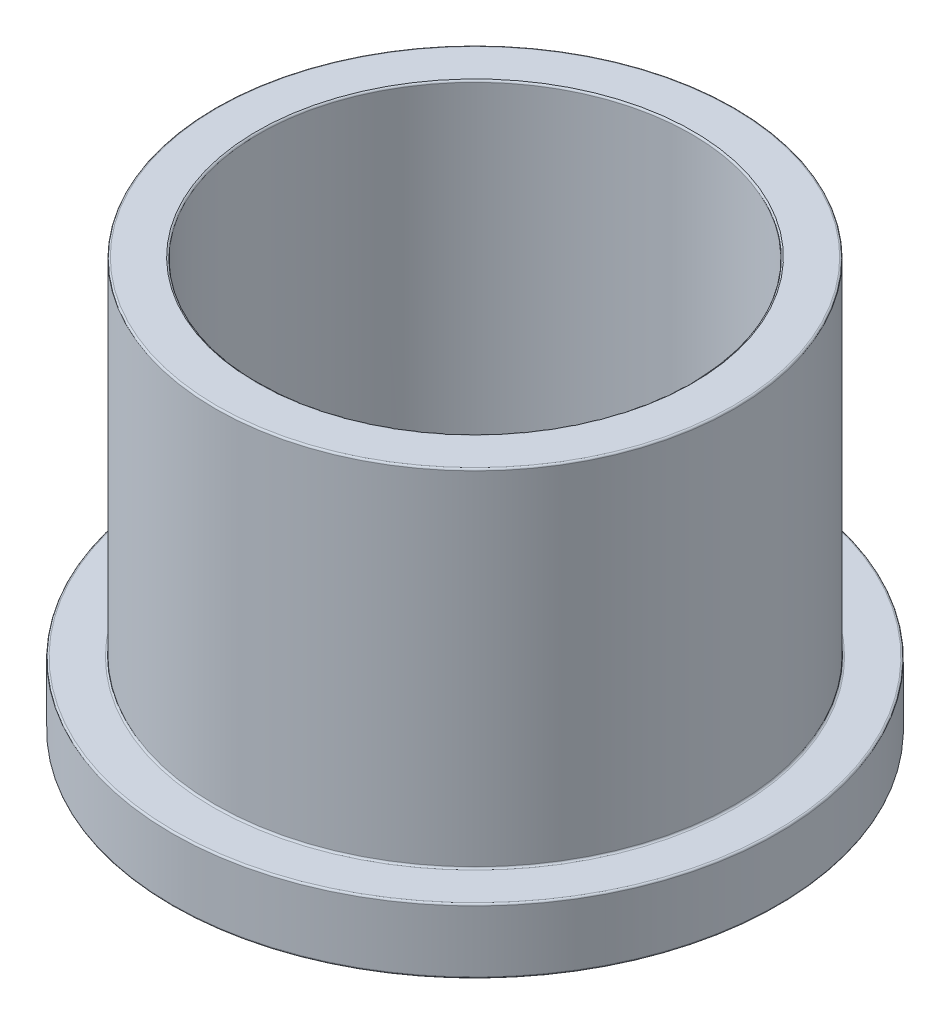
ISO-10303-21;
HEADER;
FILE_DESCRIPTION(('STEP AP214'),'2;1');
FILE_NAME('part.step','',(''),(''),'','','');
FILE_SCHEMA(('AUTOMOTIVE_DESIGN { 1 0 10303 214 1 1 1 1 }'));
ENDSEC;
DATA;
#1=APPLICATION_CONTEXT('core data for automotive mechanical design processes');
#2=APPLICATION_PROTOCOL_DEFINITION('international standard','automotive_design',2000,#1);
#3=PRODUCT_CONTEXT('',#1,'mechanical');
#4=PRODUCT('Part','Part','',(#3));
#5=PRODUCT_RELATED_PRODUCT_CATEGORY('part','',(#4));
#6=PRODUCT_DEFINITION_FORMATION('','',#4);
#7=PRODUCT_DEFINITION_CONTEXT('part definition',#1,'design');
#8=PRODUCT_DEFINITION('design','',#6,#7);
#9=PRODUCT_DEFINITION_SHAPE('','',#8);
#10=(LENGTH_UNIT() NAMED_UNIT(*) SI_UNIT(.MILLI.,.METRE.));
#11=(NAMED_UNIT(*) PLANE_ANGLE_UNIT() SI_UNIT($,.RADIAN.));
#12=(NAMED_UNIT(*) SI_UNIT($,.STERADIAN.) SOLID_ANGLE_UNIT());
#13=UNCERTAINTY_MEASURE_WITH_UNIT(LENGTH_MEASURE(1.E-05),#10,'distance_accuracy_value','');
#14=(GEOMETRIC_REPRESENTATION_CONTEXT(3) GLOBAL_UNCERTAINTY_ASSIGNED_CONTEXT((#13)) GLOBAL_UNIT_ASSIGNED_CONTEXT((#10,
#11,#12)) REPRESENTATION_CONTEXT('',''));
#15=CARTESIAN_POINT('',(0.,0.,0.));
#16=DIRECTION('',(0.,0.,1.));
#17=DIRECTION('',(1.,0.,0.));
#18=AXIS2_PLACEMENT_3D('',#15,#16,#17);
#19=CARTESIAN_POINT('',(22.225,0.,0.));
#20=DIRECTION('',(0.,-1.,0.));
#21=DIRECTION('',(0.,0.,-1.));
#22=AXIS2_PLACEMENT_3D('',#19,#20,#21);
#23=PLANE('',#22);
#24=CARTESIAN_POINT('',(0.,0.,0.));
#25=DIRECTION('',(0.,-1.,0.));
#26=DIRECTION('',(0.,0.,-1.));
#27=AXIS2_PLACEMENT_3D('',#24,#25,#26);
#28=CIRCLE('',#27,22.098);
#29=CARTESIAN_POINT('',(0.,0.,-22.098));
#30=VERTEX_POINT('',#29);
#31=EDGE_CURVE('E68',#30,#30,#28,.T.);
#32=ORIENTED_EDGE('',*,*,#31,.T.);
#33=EDGE_LOOP('',(#32));
#34=FACE_BOUND('',#33,.T.);
#35=CARTESIAN_POINT('',(0.,0.,0.));
#36=DIRECTION('',(0.,-1.,0.));
#37=DIRECTION('',(0.,0.,-1.));
#38=AXIS2_PLACEMENT_3D('',#35,#36,#37);
#39=CIRCLE('',#38,16.002);
#40=CARTESIAN_POINT('',(0.,0.,-16.002));
#41=VERTEX_POINT('',#40);
#42=EDGE_CURVE('E71',#41,#41,#39,.F.);
#43=ORIENTED_EDGE('',*,*,#42,.T.);
#44=EDGE_LOOP('',(#43));
#45=FACE_BOUND('',#44,.T.);
#46=ADVANCED_FACE('F30',(#34,#45),#23,.T.);
#47=CARTESIAN_POINT('',(0.,0.,0.));
#48=DIRECTION('',(0.,-1.,0.));
#49=DIRECTION('',(0.,0.,-1.));
#50=AXIS2_PLACEMENT_3D('',#47,#48,#49);
#51=CYLINDRICAL_SURFACE('',#50,15.875);
#52=CARTESIAN_POINT('',(0.,30.0355,0.));
#53=DIRECTION('',(0.,1.,0.));
#54=DIRECTION('',(0.,0.,1.));
#55=AXIS2_PLACEMENT_3D('',#52,#53,#54);
#56=CIRCLE('',#55,15.875);
#57=CARTESIAN_POINT('',(0.,30.0355,15.875));
#58=VERTEX_POINT('',#57);
#59=EDGE_CURVE('E10',#58,#58,#56,.T.);
#60=ORIENTED_EDGE('',*,*,#59,.T.);
#61=EDGE_LOOP('',(#60));
#62=FACE_BOUND('',#61,.T.);
#63=CARTESIAN_POINT('',(0.,0.127000000000001,0.));
#64=DIRECTION('',(0.,-1.,0.));
#65=DIRECTION('',(0.,0.,-1.));
#66=AXIS2_PLACEMENT_3D('',#63,#64,#65);
#67=CIRCLE('',#66,15.875);
#68=CARTESIAN_POINT('',(0.,0.127000000000001,-15.875));
#69=VERTEX_POINT('',#68);
#70=EDGE_CURVE('E37',#69,#69,#67,.T.);
#71=ORIENTED_EDGE('',*,*,#70,.T.);
#72=EDGE_LOOP('',(#71));
#73=FACE_BOUND('',#72,.T.);
#74=ADVANCED_FACE('F85',(#62,#73),#51,.F.);
#75=CARTESIAN_POINT('',(15.875,30.1625,0.));
#76=DIRECTION('',(0.,1.,0.));
#77=DIRECTION('',(0.,0.,1.));
#78=AXIS2_PLACEMENT_3D('',#75,#76,#77);
#79=PLANE('',#78);
#80=CARTESIAN_POINT('',(0.,30.1625,0.));
#81=DIRECTION('',(0.,1.,0.));
#82=DIRECTION('',(0.,0.,1.));
#83=AXIS2_PLACEMENT_3D('',#80,#81,#82);
#84=CIRCLE('',#83,18.923);
#85=CARTESIAN_POINT('',(0.,30.1625,18.923));
#86=VERTEX_POINT('',#85);
#87=EDGE_CURVE('E41',#86,#86,#84,.T.);
#88=ORIENTED_EDGE('',*,*,#87,.T.);
#89=EDGE_LOOP('',(#88));
#90=FACE_BOUND('',#89,.T.);
#91=CARTESIAN_POINT('',(0.,30.1625,0.));
#92=DIRECTION('',(0.,1.,0.));
#93=DIRECTION('',(0.,0.,1.));
#94=AXIS2_PLACEMENT_3D('',#91,#92,#93);
#95=CIRCLE('',#94,16.002);
#96=CARTESIAN_POINT('',(0.,30.1625,16.002));
#97=VERTEX_POINT('',#96);
#98=EDGE_CURVE('E45',#97,#97,#95,.F.);
#99=ORIENTED_EDGE('',*,*,#98,.T.);
#100=EDGE_LOOP('',(#99));
#101=FACE_BOUND('',#100,.T.);
#102=ADVANCED_FACE('F91',(#90,#101),#79,.T.);
#103=CARTESIAN_POINT('',(0.,0.,0.));
#104=DIRECTION('',(0.,-1.,0.));
#105=DIRECTION('',(0.,0.,-1.));
#106=AXIS2_PLACEMENT_3D('',#103,#104,#105);
#107=CYLINDRICAL_SURFACE('',#106,19.05);
#108=CARTESIAN_POINT('',(0.,4.8895,0.));
#109=DIRECTION('',(0.,1.,0.));
#110=DIRECTION('',(0.,0.,1.));
#111=AXIS2_PLACEMENT_3D('',#108,#109,#110);
#112=CIRCLE('',#111,19.05);
#113=CARTESIAN_POINT('',(0.,4.8895,19.05));
#114=VERTEX_POINT('',#113);
#115=EDGE_CURVE('E50',#114,#114,#112,.T.);
#116=ORIENTED_EDGE('',*,*,#115,.T.);
#117=EDGE_LOOP('',(#116));
#118=FACE_BOUND('',#117,.T.);
#119=CARTESIAN_POINT('',(0.,30.0355,0.));
#120=DIRECTION('',(0.,1.,0.));
#121=DIRECTION('',(0.,0.,1.));
#122=AXIS2_PLACEMENT_3D('',#119,#120,#121);
#123=CIRCLE('',#122,19.05);
#124=CARTESIAN_POINT('',(0.,30.0355,19.05));
#125=VERTEX_POINT('',#124);
#126=EDGE_CURVE('E53',#125,#125,#123,.F.);
#127=ORIENTED_EDGE('',*,*,#126,.T.);
#128=EDGE_LOOP('',(#127));
#129=FACE_BOUND('',#128,.T.);
#130=ADVANCED_FACE('F116',(#118,#129),#107,.T.);
#131=CARTESIAN_POINT('',(19.05,4.7625,0.));
#132=DIRECTION('',(0.,1.,0.));
#133=DIRECTION('',(0.,0.,1.));
#134=AXIS2_PLACEMENT_3D('',#131,#132,#133);
#135=PLANE('',#134);
#136=CARTESIAN_POINT('',(0.,4.7625,0.));
#137=DIRECTION('',(0.,1.,0.));
#138=DIRECTION('',(0.,0.,1.));
#139=AXIS2_PLACEMENT_3D('',#136,#137,#138);
#140=CIRCLE('',#139,22.098);
#141=CARTESIAN_POINT('',(0.,4.7625,22.098));
#142=VERTEX_POINT('',#141);
#143=EDGE_CURVE('E56',#142,#142,#140,.T.);
#144=ORIENTED_EDGE('',*,*,#143,.T.);
#145=EDGE_LOOP('',(#144));
#146=FACE_BOUND('',#145,.T.);
#147=CARTESIAN_POINT('',(0.,4.7625,0.));
#148=DIRECTION('',(0.,1.,0.));
#149=DIRECTION('',(0.,0.,1.));
#150=AXIS2_PLACEMENT_3D('',#147,#148,#149);
#151=CIRCLE('',#150,19.177);
#152=CARTESIAN_POINT('',(0.,4.7625,19.177));
#153=VERTEX_POINT('',#152);
#154=EDGE_CURVE('E59',#153,#153,#151,.F.);
#155=ORIENTED_EDGE('',*,*,#154,.T.);
#156=EDGE_LOOP('',(#155));
#157=FACE_BOUND('',#156,.T.);
#158=ADVANCED_FACE('F118',(#146,#157),#135,.T.);
#159=CARTESIAN_POINT('',(0.,0.,0.));
#160=DIRECTION('',(0.,-1.,0.));
#161=DIRECTION('',(0.,0.,-1.));
#162=AXIS2_PLACEMENT_3D('',#159,#160,#161);
#163=CYLINDRICAL_SURFACE('',#162,22.225);
#164=CARTESIAN_POINT('',(0.,0.127000000000001,0.));
#165=DIRECTION('',(0.,-1.,0.));
#166=DIRECTION('',(0.,0.,-1.));
#167=AXIS2_PLACEMENT_3D('',#164,#165,#166);
#168=CIRCLE('',#167,22.225);
#169=CARTESIAN_POINT('',(0.,0.127000000000001,-22.225));
#170=VERTEX_POINT('',#169);
#171=EDGE_CURVE('E62',#170,#170,#168,.F.);
#172=ORIENTED_EDGE('',*,*,#171,.T.);
#173=EDGE_LOOP('',(#172));
#174=FACE_BOUND('',#173,.T.);
#175=CARTESIAN_POINT('',(0.,4.6355,0.));
#176=DIRECTION('',(0.,1.,0.));
#177=DIRECTION('',(0.,0.,1.));
#178=AXIS2_PLACEMENT_3D('',#175,#176,#177);
#179=CIRCLE('',#178,22.225);
#180=CARTESIAN_POINT('',(0.,4.6355,22.225));
#181=VERTEX_POINT('',#180);
#182=EDGE_CURVE('E65',#181,#181,#179,.F.);
#183=ORIENTED_EDGE('',*,*,#182,.T.);
#184=EDGE_LOOP('',(#183));
#185=FACE_BOUND('',#184,.T.);
#186=ADVANCED_FACE('F99',(#174,#185),#163,.T.);
#187=CARTESIAN_POINT('',(0.,0.127000000000001,0.));
#188=DIRECTION('',(0.,-1.,0.));
#189=DIRECTION('',(0.,0.,-1.));
#190=AXIS2_PLACEMENT_3D('',#187,#188,#189);
#191=TOROIDAL_SURFACE('',#190,22.098,0.127);
#192=ORIENTED_EDGE('',*,*,#171,.F.);
#193=EDGE_LOOP('',(#192));
#194=FACE_BOUND('',#193,.T.);
#195=ORIENTED_EDGE('',*,*,#31,.F.);
#196=EDGE_LOOP('',(#195));
#197=FACE_BOUND('',#196,.T.);
#198=ADVANCED_FACE('F95',(#194,#197),#191,.T.);
#199=CARTESIAN_POINT('',(0.,4.6355,0.));
#200=DIRECTION('',(0.,1.,0.));
#201=DIRECTION('',(0.,0.,1.));
#202=AXIS2_PLACEMENT_3D('',#199,#200,#201);
#203=TOROIDAL_SURFACE('',#202,22.098,0.127);
#204=ORIENTED_EDGE('',*,*,#143,.F.);
#205=EDGE_LOOP('',(#204));
#206=FACE_BOUND('',#205,.T.);
#207=ORIENTED_EDGE('',*,*,#182,.F.);
#208=EDGE_LOOP('',(#207));
#209=FACE_BOUND('',#208,.T.);
#210=ADVANCED_FACE('F98',(#206,#209),#203,.T.);
#211=CARTESIAN_POINT('',(0.,4.8895,0.));
#212=DIRECTION('',(0.,1.,0.));
#213=DIRECTION('',(0.,0.,1.));
#214=AXIS2_PLACEMENT_3D('',#211,#212,#213);
#215=TOROIDAL_SURFACE('',#214,19.177,0.127);
#216=ORIENTED_EDGE('',*,*,#115,.F.);
#217=EDGE_LOOP('',(#216));
#218=FACE_BOUND('',#217,.T.);
#219=ORIENTED_EDGE('',*,*,#154,.F.);
#220=EDGE_LOOP('',(#219));
#221=FACE_BOUND('',#220,.T.);
#222=ADVANCED_FACE('F103',(#218,#221),#215,.F.);
#223=CARTESIAN_POINT('',(0.,30.0355,0.));
#224=DIRECTION('',(0.,1.,0.));
#225=DIRECTION('',(0.,0.,1.));
#226=AXIS2_PLACEMENT_3D('',#223,#224,#225);
#227=TOROIDAL_SURFACE('',#226,18.923,0.127);
#228=ORIENTED_EDGE('',*,*,#87,.F.);
#229=EDGE_LOOP('',(#228));
#230=FACE_BOUND('',#229,.T.);
#231=ORIENTED_EDGE('',*,*,#126,.F.);
#232=EDGE_LOOP('',(#231));
#233=FACE_BOUND('',#232,.T.);
#234=ADVANCED_FACE('F82',(#230,#233),#227,.T.);
#235=CARTESIAN_POINT('',(0.,30.0355,0.));
#236=DIRECTION('',(0.,1.,0.));
#237=DIRECTION('',(0.,0.,1.));
#238=AXIS2_PLACEMENT_3D('',#235,#236,#237);
#239=TOROIDAL_SURFACE('',#238,16.002,0.127);
#240=ORIENTED_EDGE('',*,*,#59,.F.);
#241=EDGE_LOOP('',(#240));
#242=FACE_BOUND('',#241,.T.);
#243=ORIENTED_EDGE('',*,*,#98,.F.);
#244=EDGE_LOOP('',(#243));
#245=FACE_BOUND('',#244,.T.);
#246=ADVANCED_FACE('F78',(#242,#245),#239,.T.);
#247=CARTESIAN_POINT('',(0.,0.127000000000001,0.));
#248=DIRECTION('',(0.,-1.,0.));
#249=DIRECTION('',(0.,0.,-1.));
#250=AXIS2_PLACEMENT_3D('',#247,#248,#249);
#251=TOROIDAL_SURFACE('',#250,16.002,0.127);
#252=ORIENTED_EDGE('',*,*,#42,.F.);
#253=EDGE_LOOP('',(#252));
#254=FACE_BOUND('',#253,.T.);
#255=ORIENTED_EDGE('',*,*,#70,.F.);
#256=EDGE_LOOP('',(#255));
#257=FACE_BOUND('',#256,.T.);
#258=ADVANCED_FACE('F32',(#254,#257),#251,.T.);
#259=CLOSED_SHELL('',(#46,#74,#102,#130,#158,#186,#198,#210,#222,#234,#246,#258));
#260=MANIFOLD_SOLID_BREP('B2',#259);
#261=ADVANCED_BREP_SHAPE_REPRESENTATION('',(#18,#260),#14);
#262=SHAPE_DEFINITION_REPRESENTATION(#9,#261);
ENDSEC;
END-ISO-10303-21;
